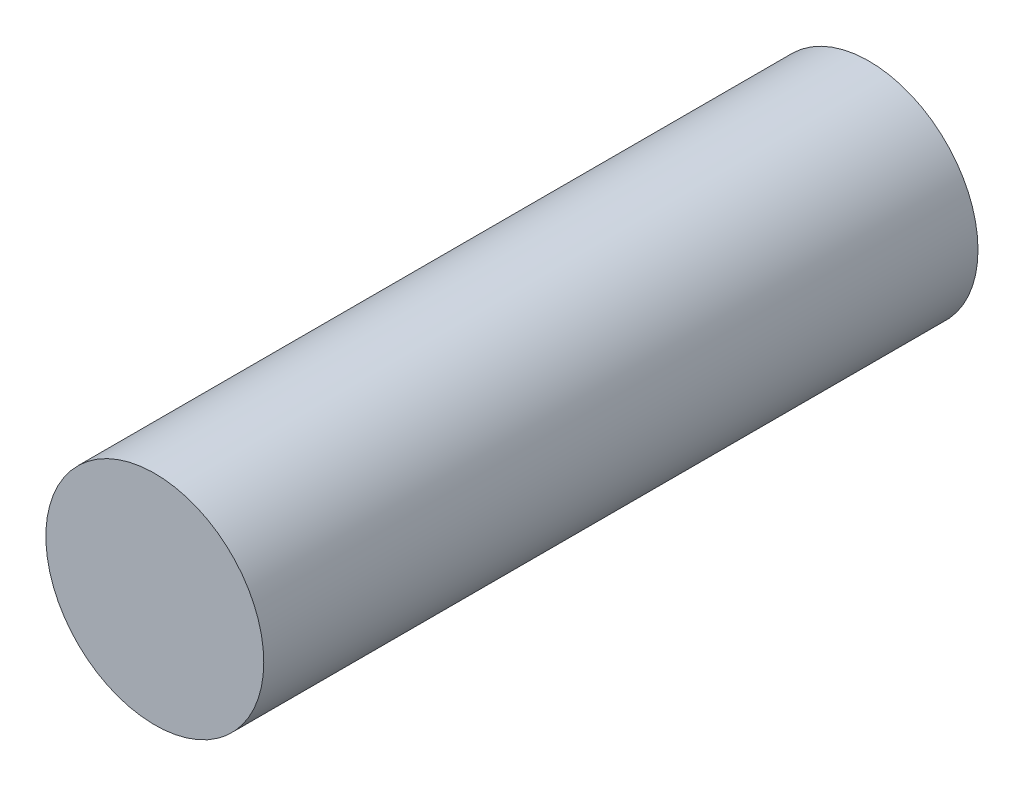
ISO-10303-21;
HEADER;
FILE_DESCRIPTION(('STEP AP214'),'2;1');
FILE_NAME('part.step','',(''),(''),'','','');
FILE_SCHEMA(('AUTOMOTIVE_DESIGN { 1 0 10303 214 1 1 1 1 }'));
ENDSEC;
DATA;
#1=APPLICATION_CONTEXT('core data for automotive mechanical design processes');
#2=APPLICATION_PROTOCOL_DEFINITION('international standard','automotive_design',2000,#1);
#3=PRODUCT_CONTEXT('',#1,'mechanical');
#4=PRODUCT('Part','Part','',(#3));
#5=PRODUCT_RELATED_PRODUCT_CATEGORY('part','',(#4));
#6=PRODUCT_DEFINITION_FORMATION('','',#4);
#7=PRODUCT_DEFINITION_CONTEXT('part definition',#1,'design');
#8=PRODUCT_DEFINITION('design','',#6,#7);
#9=PRODUCT_DEFINITION_SHAPE('','',#8);
#10=(LENGTH_UNIT() NAMED_UNIT(*) SI_UNIT(.MILLI.,.METRE.));
#11=(NAMED_UNIT(*) PLANE_ANGLE_UNIT() SI_UNIT($,.RADIAN.));
#12=(NAMED_UNIT(*) SI_UNIT($,.STERADIAN.) SOLID_ANGLE_UNIT());
#13=UNCERTAINTY_MEASURE_WITH_UNIT(LENGTH_MEASURE(1.E-05),#10,'distance_accuracy_value','');
#14=(GEOMETRIC_REPRESENTATION_CONTEXT(3) GLOBAL_UNCERTAINTY_ASSIGNED_CONTEXT((#13)) GLOBAL_UNIT_ASSIGNED_CONTEXT((#10,
#11,#12)) REPRESENTATION_CONTEXT('',''));
#15=CARTESIAN_POINT('',(0.,0.,0.));
#16=DIRECTION('',(0.,0.,1.));
#17=DIRECTION('',(1.,0.,0.));
#18=AXIS2_PLACEMENT_3D('',#15,#16,#17);
#19=CARTESIAN_POINT('',(0.,0.,333.));
#20=DIRECTION('',(0.,0.,-1.));
#21=DIRECTION('',(-1.,0.,0.));
#22=AXIS2_PLACEMENT_3D('',#19,#20,#21);
#23=CYLINDRICAL_SURFACE('',#22,50.8);
#24=CARTESIAN_POINT('',(0.,0.,333.));
#25=DIRECTION('',(0.,0.,1.));
#26=DIRECTION('',(1.,0.,0.));
#27=AXIS2_PLACEMENT_3D('',#24,#25,#26);
#28=CIRCLE('',#27,50.8);
#29=CARTESIAN_POINT('',(50.8,0.,333.));
#30=VERTEX_POINT('',#29);
#31=EDGE_CURVE('E10',#30,#30,#28,.T.);
#32=ORIENTED_EDGE('',*,*,#31,.F.);
#33=EDGE_LOOP('',(#32));
#34=FACE_BOUND('',#33,.T.);
#35=CARTESIAN_POINT('',(0.,0.,0.));
#36=DIRECTION('',(0.,0.,1.));
#37=DIRECTION('',(1.,0.,0.));
#38=AXIS2_PLACEMENT_3D('',#35,#36,#37);
#39=CIRCLE('',#38,50.8);
#40=CARTESIAN_POINT('',(50.8,0.,0.));
#41=VERTEX_POINT('',#40);
#42=EDGE_CURVE('E40',#41,#41,#39,.T.);
#43=ORIENTED_EDGE('',*,*,#42,.T.);
#44=EDGE_LOOP('',(#43));
#45=FACE_BOUND('',#44,.T.);
#46=ADVANCED_FACE('F37',(#34,#45),#23,.T.);
#47=CARTESIAN_POINT('',(0.,0.,333.));
#48=DIRECTION('',(0.,0.,1.));
#49=DIRECTION('',(1.,0.,0.));
#50=AXIS2_PLACEMENT_3D('',#47,#48,#49);
#51=PLANE('',#50);
#52=ORIENTED_EDGE('',*,*,#31,.T.);
#53=EDGE_LOOP('',(#52));
#54=FACE_BOUND('',#53,.T.);
#55=ADVANCED_FACE('F54',(#54),#51,.T.);
#56=CARTESIAN_POINT('',(0.,0.,0.));
#57=DIRECTION('',(0.,0.,1.));
#58=DIRECTION('',(1.,0.,0.));
#59=AXIS2_PLACEMENT_3D('',#56,#57,#58);
#60=PLANE('',#59);
#61=ORIENTED_EDGE('',*,*,#42,.F.);
#62=EDGE_LOOP('',(#61));
#63=FACE_BOUND('',#62,.T.);
#64=ADVANCED_FACE('F52',(#63),#60,.F.);
#65=CLOSED_SHELL('',(#46,#55,#64));
#66=MANIFOLD_SOLID_BREP('B2',#65);
#67=ADVANCED_BREP_SHAPE_REPRESENTATION('',(#18,#66),#14);
#68=SHAPE_DEFINITION_REPRESENTATION(#9,#67);
ENDSEC;
END-ISO-10303-21;
